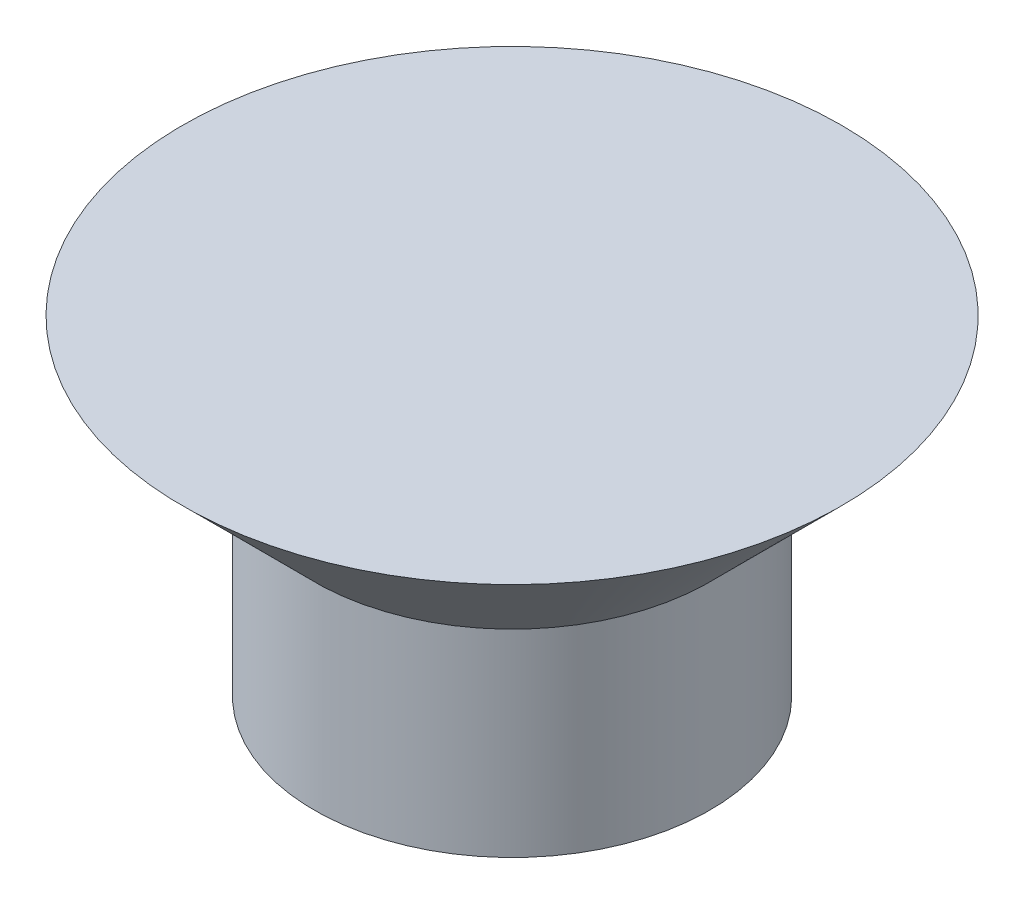
ISO-10303-21;
HEADER;
FILE_DESCRIPTION(('STEP AP214'),'2;1');
FILE_NAME('part.step','',(''),(''),'','','');
FILE_SCHEMA(('AUTOMOTIVE_DESIGN { 1 0 10303 214 1 1 1 1 }'));
ENDSEC;
DATA;
#1=APPLICATION_CONTEXT('core data for automotive mechanical design processes');
#2=APPLICATION_PROTOCOL_DEFINITION('international standard','automotive_design',2000,#1);
#3=PRODUCT_CONTEXT('',#1,'mechanical');
#4=PRODUCT('Part','Part','',(#3));
#5=PRODUCT_RELATED_PRODUCT_CATEGORY('part','',(#4));
#6=PRODUCT_DEFINITION_FORMATION('','',#4);
#7=PRODUCT_DEFINITION_CONTEXT('part definition',#1,'design');
#8=PRODUCT_DEFINITION('design','',#6,#7);
#9=PRODUCT_DEFINITION_SHAPE('','',#8);
#10=(LENGTH_UNIT() NAMED_UNIT(*) SI_UNIT(.MILLI.,.METRE.));
#11=(NAMED_UNIT(*) PLANE_ANGLE_UNIT() SI_UNIT($,.RADIAN.));
#12=(NAMED_UNIT(*) SI_UNIT($,.STERADIAN.) SOLID_ANGLE_UNIT());
#13=UNCERTAINTY_MEASURE_WITH_UNIT(LENGTH_MEASURE(1.E-05),#10,'distance_accuracy_value','');
#14=(GEOMETRIC_REPRESENTATION_CONTEXT(3) GLOBAL_UNCERTAINTY_ASSIGNED_CONTEXT((#13)) GLOBAL_UNIT_ASSIGNED_CONTEXT((#10,
#11,#12)) REPRESENTATION_CONTEXT('',''));
#15=CARTESIAN_POINT('',(0.,0.,0.));
#16=DIRECTION('',(0.,0.,1.));
#17=DIRECTION('',(1.,0.,0.));
#18=AXIS2_PLACEMENT_3D('',#15,#16,#17);
#19=CARTESIAN_POINT('',(1.5,0.,0.));
#20=DIRECTION('',(0.,-1.,0.));
#21=DIRECTION('',(0.,0.,-1.));
#22=AXIS2_PLACEMENT_3D('',#19,#20,#21);
#23=PLANE('',#22);
#24=CARTESIAN_POINT('',(0.,0.,0.));
#25=DIRECTION('',(0.,-1.,0.));
#26=DIRECTION('',(0.,0.,-1.));
#27=AXIS2_PLACEMENT_3D('',#24,#25,#26);
#28=CIRCLE('',#27,1.5);
#29=CARTESIAN_POINT('',(0.,0.,-1.5));
#30=VERTEX_POINT('',#29);
#31=EDGE_CURVE('E44',#30,#30,#28,.T.);
#32=ORIENTED_EDGE('',*,*,#31,.T.);
#33=EDGE_LOOP('',(#32));
#34=FACE_BOUND('',#33,.T.);
#35=ADVANCED_FACE('F34',(#34),#23,.T.);
#36=CARTESIAN_POINT('',(0.,2.5,0.));
#37=DIRECTION('',(0.,1.,0.));
#38=DIRECTION('',(0.,0.,1.));
#39=AXIS2_PLACEMENT_3D('',#36,#37,#38);
#40=PLANE('',#39);
#41=CARTESIAN_POINT('',(0.,2.5,0.));
#42=DIRECTION('',(0.,-1.,0.));
#43=DIRECTION('',(0.,0.,-1.));
#44=AXIS2_PLACEMENT_3D('',#41,#42,#43);
#45=CIRCLE('',#44,2.5);
#46=CARTESIAN_POINT('',(0.,2.5,-2.5));
#47=VERTEX_POINT('',#46);
#48=EDGE_CURVE('E11',#47,#47,#45,.T.);
#49=ORIENTED_EDGE('',*,*,#48,.F.);
#50=EDGE_LOOP('',(#49));
#51=FACE_BOUND('',#50,.T.);
#52=ADVANCED_FACE('F59',(#51),#40,.T.);
#53=CARTESIAN_POINT('',(0.,1.5,0.));
#54=DIRECTION('',(0.,1.,0.));
#55=DIRECTION('',(0.,0.,1.));
#56=AXIS2_PLACEMENT_3D('',#53,#54,#55);
#57=CONICAL_SURFACE('',#56,1.5,0.785398163397448);
#58=ORIENTED_EDGE('',*,*,#48,.T.);
#59=EDGE_LOOP('',(#58));
#60=FACE_BOUND('',#59,.T.);
#61=CARTESIAN_POINT('',(0.,1.5,0.));
#62=DIRECTION('',(0.,-1.,0.));
#63=DIRECTION('',(0.,0.,-1.));
#64=AXIS2_PLACEMENT_3D('',#61,#62,#63);
#65=CIRCLE('',#64,1.5);
#66=CARTESIAN_POINT('',(0.,1.5,-1.5));
#67=VERTEX_POINT('',#66);
#68=EDGE_CURVE('E40',#67,#67,#65,.T.);
#69=ORIENTED_EDGE('',*,*,#68,.F.);
#70=EDGE_LOOP('',(#69));
#71=FACE_BOUND('',#70,.T.);
#72=ADVANCED_FACE('F54',(#60,#71),#57,.T.);
#73=CARTESIAN_POINT('',(0.,0.,0.));
#74=DIRECTION('',(0.,-1.,0.));
#75=DIRECTION('',(0.,0.,-1.));
#76=AXIS2_PLACEMENT_3D('',#73,#74,#75);
#77=CYLINDRICAL_SURFACE('',#76,1.5);
#78=ORIENTED_EDGE('',*,*,#68,.T.);
#79=EDGE_LOOP('',(#78));
#80=FACE_BOUND('',#79,.T.);
#81=ORIENTED_EDGE('',*,*,#31,.F.);
#82=EDGE_LOOP('',(#81));
#83=FACE_BOUND('',#82,.T.);
#84=ADVANCED_FACE('F52',(#80,#83),#77,.T.);
#85=CLOSED_SHELL('',(#35,#52,#72,#84));
#86=MANIFOLD_SOLID_BREP('B2',#85);
#87=ADVANCED_BREP_SHAPE_REPRESENTATION('',(#18,#86),#14);
#88=SHAPE_DEFINITION_REPRESENTATION(#9,#87);
ENDSEC;
END-ISO-10303-21;
